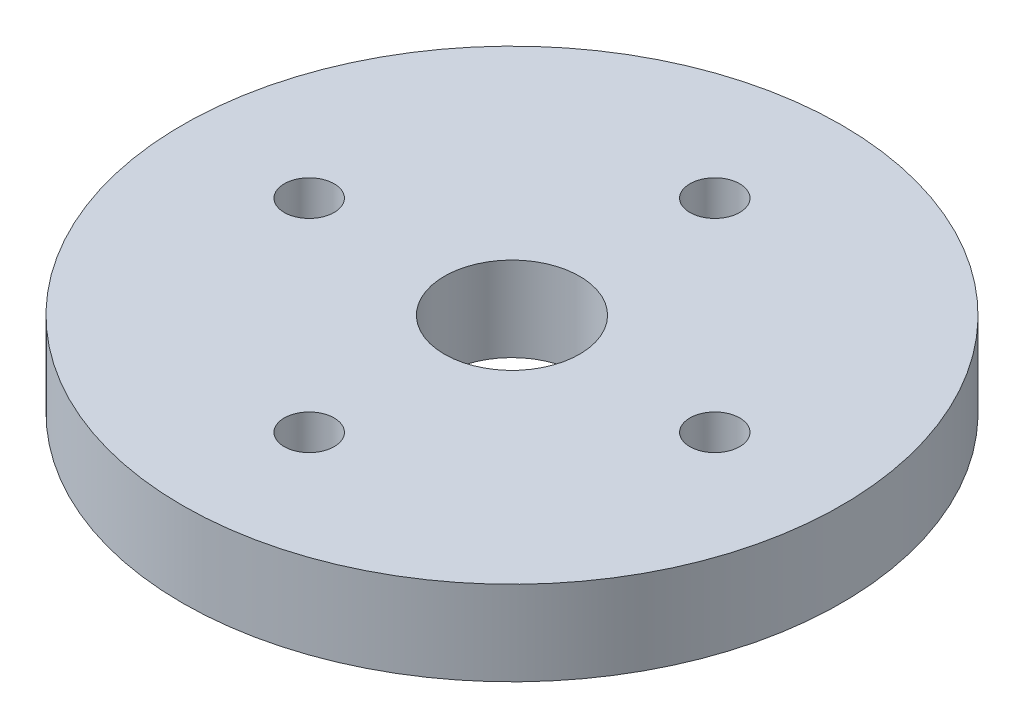
ISO-10303-21;
HEADER;
FILE_DESCRIPTION(('STEP AP214'),'2;1');
FILE_NAME('part.step','',(''),(''),'','','');
FILE_SCHEMA(('AUTOMOTIVE_DESIGN { 1 0 10303 214 1 1 1 1 }'));
ENDSEC;
DATA;
#1=APPLICATION_CONTEXT('core data for automotive mechanical design processes');
#2=APPLICATION_PROTOCOL_DEFINITION('international standard','automotive_design',2000,#1);
#3=PRODUCT_CONTEXT('',#1,'mechanical');
#4=PRODUCT('Part','Part','',(#3));
#5=PRODUCT_RELATED_PRODUCT_CATEGORY('part','',(#4));
#6=PRODUCT_DEFINITION_FORMATION('','',#4);
#7=PRODUCT_DEFINITION_CONTEXT('part definition',#1,'design');
#8=PRODUCT_DEFINITION('design','',#6,#7);
#9=PRODUCT_DEFINITION_SHAPE('','',#8);
#10=(LENGTH_UNIT() NAMED_UNIT(*) SI_UNIT(.MILLI.,.METRE.));
#11=(NAMED_UNIT(*) PLANE_ANGLE_UNIT() SI_UNIT($,.RADIAN.));
#12=(NAMED_UNIT(*) SI_UNIT($,.STERADIAN.) SOLID_ANGLE_UNIT());
#13=UNCERTAINTY_MEASURE_WITH_UNIT(LENGTH_MEASURE(1.E-05),#10,'distance_accuracy_value','');
#14=(GEOMETRIC_REPRESENTATION_CONTEXT(3) GLOBAL_UNCERTAINTY_ASSIGNED_CONTEXT((#13)) GLOBAL_UNIT_ASSIGNED_CONTEXT((#10,
#11,#12)) REPRESENTATION_CONTEXT('',''));
#15=CARTESIAN_POINT('',(0.,0.,0.));
#16=DIRECTION('',(0.,0.,1.));
#17=DIRECTION('',(1.,0.,0.));
#18=AXIS2_PLACEMENT_3D('',#15,#16,#17);
#19=CARTESIAN_POINT('',(0.,5.,0.));
#20=DIRECTION('',(0.,1.,0.));
#21=DIRECTION('',(0.,0.,1.));
#22=AXIS2_PLACEMENT_3D('',#19,#20,#21);
#23=PLANE('',#22);
#24=CARTESIAN_POINT('',(12.,5.,0.));
#25=DIRECTION('',(0.,1.,0.));
#26=DIRECTION('',(0.,0.,-1.));
#27=AXIS2_PLACEMENT_3D('',#24,#25,#26);
#28=CIRCLE('',#27,1.475);
#29=CARTESIAN_POINT('',(12.,5.,-1.475));
#30=VERTEX_POINT('',#29);
#31=EDGE_CURVE('E62',#30,#30,#28,.T.);
#32=ORIENTED_EDGE('',*,*,#31,.F.);
#33=EDGE_LOOP('',(#32));
#34=FACE_BOUND('',#33,.T.);
#35=CARTESIAN_POINT('',(0.,5.,-12.));
#36=DIRECTION('',(0.,1.,0.));
#37=DIRECTION('',(0.,0.,1.));
#38=AXIS2_PLACEMENT_3D('',#35,#36,#37);
#39=CIRCLE('',#38,1.475);
#40=CARTESIAN_POINT('',(0.,5.,-10.525));
#41=VERTEX_POINT('',#40);
#42=EDGE_CURVE('E50',#41,#41,#39,.T.);
#43=ORIENTED_EDGE('',*,*,#42,.F.);
#44=EDGE_LOOP('',(#43));
#45=FACE_BOUND('',#44,.T.);
#46=CARTESIAN_POINT('',(0.,5.,0.));
#47=DIRECTION('',(0.,1.,0.));
#48=DIRECTION('',(0.,0.,1.));
#49=AXIS2_PLACEMENT_3D('',#46,#47,#48);
#50=CIRCLE('',#49,19.5);
#51=CARTESIAN_POINT('',(0.,5.,19.5));
#52=VERTEX_POINT('',#51);
#53=EDGE_CURVE('E10',#52,#52,#50,.T.);
#54=ORIENTED_EDGE('',*,*,#53,.T.);
#55=EDGE_LOOP('',(#54));
#56=FACE_BOUND('',#55,.T.);
#57=CARTESIAN_POINT('',(0.,5.,0.));
#58=DIRECTION('',(0.,1.,0.));
#59=DIRECTION('',(0.,0.,1.));
#60=AXIS2_PLACEMENT_3D('',#57,#58,#59);
#61=CIRCLE('',#60,4.);
#62=CARTESIAN_POINT('',(0.,5.,4.));
#63=VERTEX_POINT('',#62);
#64=EDGE_CURVE('E45',#63,#63,#61,.T.);
#65=ORIENTED_EDGE('',*,*,#64,.F.);
#66=EDGE_LOOP('',(#65));
#67=FACE_BOUND('',#66,.T.);
#68=CARTESIAN_POINT('',(-12.,5.,0.));
#69=DIRECTION('',(0.,1.,0.));
#70=DIRECTION('',(0.,0.,1.));
#71=AXIS2_PLACEMENT_3D('',#68,#69,#70);
#72=CIRCLE('',#71,1.475);
#73=CARTESIAN_POINT('',(-12.,5.,1.475));
#74=VERTEX_POINT('',#73);
#75=EDGE_CURVE('E56',#74,#74,#72,.T.);
#76=ORIENTED_EDGE('',*,*,#75,.F.);
#77=EDGE_LOOP('',(#76));
#78=FACE_BOUND('',#77,.T.);
#79=CARTESIAN_POINT('',(0.,5.,12.));
#80=DIRECTION('',(0.,1.,0.));
#81=DIRECTION('',(0.,0.,-1.));
#82=AXIS2_PLACEMENT_3D('',#79,#80,#81);
#83=CIRCLE('',#82,1.475);
#84=CARTESIAN_POINT('',(0.,5.,10.525));
#85=VERTEX_POINT('',#84);
#86=EDGE_CURVE('E68',#85,#85,#83,.T.);
#87=ORIENTED_EDGE('',*,*,#86,.F.);
#88=EDGE_LOOP('',(#87));
#89=FACE_BOUND('',#88,.T.);
#90=ADVANCED_FACE('F34',(#34,#45,#56,#67,#78,#89),#23,.T.);
#91=CARTESIAN_POINT('',(0.,0.,0.));
#92=DIRECTION('',(0.,1.,0.));
#93=DIRECTION('',(0.,0.,1.));
#94=AXIS2_PLACEMENT_3D('',#91,#92,#93);
#95=PLANE('',#94);
#96=CARTESIAN_POINT('',(0.,0.,0.));
#97=DIRECTION('',(0.,1.,0.));
#98=DIRECTION('',(0.,0.,1.));
#99=AXIS2_PLACEMENT_3D('',#96,#97,#98);
#100=CIRCLE('',#99,19.5);
#101=CARTESIAN_POINT('',(0.,0.,19.5));
#102=VERTEX_POINT('',#101);
#103=EDGE_CURVE('E38',#102,#102,#100,.T.);
#104=ORIENTED_EDGE('',*,*,#103,.F.);
#105=EDGE_LOOP('',(#104));
#106=FACE_BOUND('',#105,.T.);
#107=CARTESIAN_POINT('',(0.,0.,0.));
#108=DIRECTION('',(0.,1.,0.));
#109=DIRECTION('',(0.,0.,1.));
#110=AXIS2_PLACEMENT_3D('',#107,#108,#109);
#111=CIRCLE('',#110,4.);
#112=CARTESIAN_POINT('',(0.,0.,4.));
#113=VERTEX_POINT('',#112);
#114=EDGE_CURVE('E47',#113,#113,#111,.T.);
#115=ORIENTED_EDGE('',*,*,#114,.T.);
#116=EDGE_LOOP('',(#115));
#117=FACE_BOUND('',#116,.T.);
#118=CARTESIAN_POINT('',(0.,0.,-12.));
#119=DIRECTION('',(0.,1.,0.));
#120=DIRECTION('',(0.,0.,1.));
#121=AXIS2_PLACEMENT_3D('',#118,#119,#120);
#122=CIRCLE('',#121,1.475);
#123=CARTESIAN_POINT('',(0.,0.,-10.525));
#124=VERTEX_POINT('',#123);
#125=EDGE_CURVE('E53',#124,#124,#122,.T.);
#126=ORIENTED_EDGE('',*,*,#125,.T.);
#127=EDGE_LOOP('',(#126));
#128=FACE_BOUND('',#127,.T.);
#129=CARTESIAN_POINT('',(-12.,0.,0.));
#130=DIRECTION('',(0.,1.,0.));
#131=DIRECTION('',(0.,0.,1.));
#132=AXIS2_PLACEMENT_3D('',#129,#130,#131);
#133=CIRCLE('',#132,1.475);
#134=CARTESIAN_POINT('',(-12.,0.,1.475));
#135=VERTEX_POINT('',#134);
#136=EDGE_CURVE('E59',#135,#135,#133,.T.);
#137=ORIENTED_EDGE('',*,*,#136,.T.);
#138=EDGE_LOOP('',(#137));
#139=FACE_BOUND('',#138,.T.);
#140=CARTESIAN_POINT('',(12.,0.,0.));
#141=DIRECTION('',(0.,1.,0.));
#142=DIRECTION('',(0.,0.,-1.));
#143=AXIS2_PLACEMENT_3D('',#140,#141,#142);
#144=CIRCLE('',#143,1.475);
#145=CARTESIAN_POINT('',(12.,0.,-1.475));
#146=VERTEX_POINT('',#145);
#147=EDGE_CURVE('E65',#146,#146,#144,.T.);
#148=ORIENTED_EDGE('',*,*,#147,.T.);
#149=EDGE_LOOP('',(#148));
#150=FACE_BOUND('',#149,.T.);
#151=CARTESIAN_POINT('',(0.,0.,12.));
#152=DIRECTION('',(0.,1.,0.));
#153=DIRECTION('',(0.,0.,-1.));
#154=AXIS2_PLACEMENT_3D('',#151,#152,#153);
#155=CIRCLE('',#154,1.475);
#156=CARTESIAN_POINT('',(0.,0.,10.525));
#157=VERTEX_POINT('',#156);
#158=EDGE_CURVE('E71',#157,#157,#155,.T.);
#159=ORIENTED_EDGE('',*,*,#158,.T.);
#160=EDGE_LOOP('',(#159));
#161=FACE_BOUND('',#160,.T.);
#162=ADVANCED_FACE('F81',(#106,#117,#128,#139,#150,#161),#95,.F.);
#163=CARTESIAN_POINT('',(0.,5.,0.));
#164=DIRECTION('',(0.,-1.,0.));
#165=DIRECTION('',(0.,0.,-1.));
#166=AXIS2_PLACEMENT_3D('',#163,#164,#165);
#167=CYLINDRICAL_SURFACE('',#166,19.5);
#168=ORIENTED_EDGE('',*,*,#53,.F.);
#169=EDGE_LOOP('',(#168));
#170=FACE_BOUND('',#169,.T.);
#171=ORIENTED_EDGE('',*,*,#103,.T.);
#172=EDGE_LOOP('',(#171));
#173=FACE_BOUND('',#172,.T.);
#174=ADVANCED_FACE('F36',(#170,#173),#167,.T.);
#175=CARTESIAN_POINT('',(0.,5.,0.));
#176=DIRECTION('',(0.,-1.,0.));
#177=DIRECTION('',(0.,0.,-1.));
#178=AXIS2_PLACEMENT_3D('',#175,#176,#177);
#179=CYLINDRICAL_SURFACE('',#178,4.);
#180=ORIENTED_EDGE('',*,*,#64,.T.);
#181=EDGE_LOOP('',(#180));
#182=FACE_BOUND('',#181,.T.);
#183=ORIENTED_EDGE('',*,*,#114,.F.);
#184=EDGE_LOOP('',(#183));
#185=FACE_BOUND('',#184,.T.);
#186=ADVANCED_FACE('F91',(#182,#185),#179,.F.);
#187=CARTESIAN_POINT('',(0.,5.,-12.));
#188=DIRECTION('',(0.,-1.,0.));
#189=DIRECTION('',(0.,0.,-1.));
#190=AXIS2_PLACEMENT_3D('',#187,#188,#189);
#191=CYLINDRICAL_SURFACE('',#190,1.475);
#192=ORIENTED_EDGE('',*,*,#42,.T.);
#193=EDGE_LOOP('',(#192));
#194=FACE_BOUND('',#193,.T.);
#195=ORIENTED_EDGE('',*,*,#125,.F.);
#196=EDGE_LOOP('',(#195));
#197=FACE_BOUND('',#196,.T.);
#198=ADVANCED_FACE('F94',(#194,#197),#191,.F.);
#199=CARTESIAN_POINT('',(-12.,5.,0.));
#200=DIRECTION('',(0.,-1.,0.));
#201=DIRECTION('',(0.,0.,-1.));
#202=AXIS2_PLACEMENT_3D('',#199,#200,#201);
#203=CYLINDRICAL_SURFACE('',#202,1.475);
#204=ORIENTED_EDGE('',*,*,#75,.T.);
#205=EDGE_LOOP('',(#204));
#206=FACE_BOUND('',#205,.T.);
#207=ORIENTED_EDGE('',*,*,#136,.F.);
#208=EDGE_LOOP('',(#207));
#209=FACE_BOUND('',#208,.T.);
#210=ADVANCED_FACE('F98',(#206,#209),#203,.F.);
#211=CARTESIAN_POINT('',(12.,5.,0.));
#212=DIRECTION('',(0.,-1.,0.));
#213=DIRECTION('',(0.,0.,-1.));
#214=AXIS2_PLACEMENT_3D('',#211,#212,#213);
#215=CYLINDRICAL_SURFACE('',#214,1.475);
#216=ORIENTED_EDGE('',*,*,#31,.T.);
#217=EDGE_LOOP('',(#216));
#218=FACE_BOUND('',#217,.T.);
#219=ORIENTED_EDGE('',*,*,#147,.F.);
#220=EDGE_LOOP('',(#219));
#221=FACE_BOUND('',#220,.T.);
#222=ADVANCED_FACE('F102',(#218,#221),#215,.F.);
#223=CARTESIAN_POINT('',(0.,5.,12.));
#224=DIRECTION('',(0.,-1.,0.));
#225=DIRECTION('',(0.,0.,-1.));
#226=AXIS2_PLACEMENT_3D('',#223,#224,#225);
#227=CYLINDRICAL_SURFACE('',#226,1.475);
#228=ORIENTED_EDGE('',*,*,#86,.T.);
#229=EDGE_LOOP('',(#228));
#230=FACE_BOUND('',#229,.T.);
#231=ORIENTED_EDGE('',*,*,#158,.F.);
#232=EDGE_LOOP('',(#231));
#233=FACE_BOUND('',#232,.T.);
#234=ADVANCED_FACE('F77',(#230,#233),#227,.F.);
#235=CLOSED_SHELL('',(#90,#162,#174,#186,#198,#210,#222,#234));
#236=MANIFOLD_SOLID_BREP('B2',#235);
#237=ADVANCED_BREP_SHAPE_REPRESENTATION('',(#18,#236),#14);
#238=SHAPE_DEFINITION_REPRESENTATION(#9,#237);
ENDSEC;
END-ISO-10303-21;
